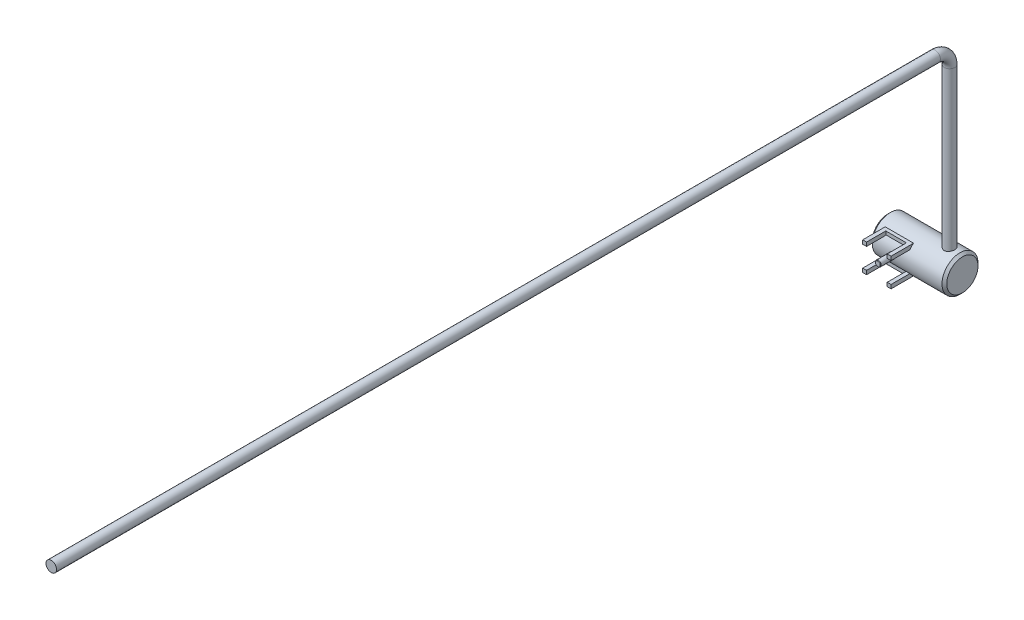
ISO-10303-21;
HEADER;
FILE_DESCRIPTION(('STEP AP214'),'2;1');
FILE_NAME('part.step','',(''),(''),'','','');
FILE_SCHEMA(('AUTOMOTIVE_DESIGN { 1 0 10303 214 1 1 1 1 }'));
ENDSEC;
DATA;
#1=APPLICATION_CONTEXT('core data for automotive mechanical design processes');
#2=APPLICATION_PROTOCOL_DEFINITION('international standard','automotive_design',2000,#1);
#3=PRODUCT_CONTEXT('',#1,'mechanical');
#4=PRODUCT('Part','Part','',(#3));
#5=PRODUCT_RELATED_PRODUCT_CATEGORY('part','',(#4));
#6=PRODUCT_DEFINITION_FORMATION('','',#4);
#7=PRODUCT_DEFINITION_CONTEXT('part definition',#1,'design');
#8=PRODUCT_DEFINITION('design','',#6,#7);
#9=PRODUCT_DEFINITION_SHAPE('','',#8);
#10=(LENGTH_UNIT() NAMED_UNIT(*) SI_UNIT(.MILLI.,.METRE.));
#11=(NAMED_UNIT(*) PLANE_ANGLE_UNIT() SI_UNIT($,.RADIAN.));
#12=(NAMED_UNIT(*) SI_UNIT($,.STERADIAN.) SOLID_ANGLE_UNIT());
#13=UNCERTAINTY_MEASURE_WITH_UNIT(LENGTH_MEASURE(1.E-05),#10,'distance_accuracy_value','');
#14=(GEOMETRIC_REPRESENTATION_CONTEXT(3) GLOBAL_UNCERTAINTY_ASSIGNED_CONTEXT((#13)) GLOBAL_UNIT_ASSIGNED_CONTEXT((#10,
#11,#12)) REPRESENTATION_CONTEXT('',''));
#15=CARTESIAN_POINT('',(0.,0.,0.));
#16=DIRECTION('',(0.,0.,1.));
#17=DIRECTION('',(1.,0.,0.));
#18=AXIS2_PLACEMENT_3D('',#15,#16,#17);
#19=CARTESIAN_POINT('',(7.65,-2.15,3.));
#20=DIRECTION('',(0.,1.,0.));
#21=DIRECTION('',(-1.,0.,0.));
#22=AXIS2_PLACEMENT_3D('',#19,#20,#21);
#23=PLANE('',#22);
#24=DIRECTION('',(1.,0.,0.));
#25=VECTOR('',#24,1.);
#26=CARTESIAN_POINT('',(7.25,-2.15,7.));
#27=LINE('',#26,#25);
#28=CARTESIAN_POINT('',(7.65,-2.15,7.));
#29=VERTEX_POINT('',#28);
#30=CARTESIAN_POINT('',(6.85,-2.15,7.));
#31=VERTEX_POINT('',#30);
#32=EDGE_CURVE('E142',#29,#31,#27,.F.);
#33=ORIENTED_EDGE('',*,*,#32,.F.);
#34=DIRECTION('',(0.,0.,-1.));
#35=VECTOR('',#34,1.);
#36=CARTESIAN_POINT('',(7.65,-2.15,0.));
#37=LINE('',#36,#35);
#38=CARTESIAN_POINT('',(7.65,-2.15,3.07245829914744));
#39=VERTEX_POINT('',#38);
#40=EDGE_CURVE('E154',#39,#29,#37,.F.);
#41=ORIENTED_EDGE('',*,*,#40,.F.);
#42=DIRECTION('',(-1.,0.,0.));
#43=VECTOR('',#42,1.);
#44=CARTESIAN_POINT('',(7.65,-2.15,3.07245829914744));
#45=LINE('',#44,#43);
#46=CARTESIAN_POINT('',(6.85,-2.15,3.07245829914744));
#47=VERTEX_POINT('',#46);
#48=EDGE_CURVE('E145',#39,#47,#45,.T.);
#49=ORIENTED_EDGE('',*,*,#48,.T.);
#50=DIRECTION('',(0.,0.,1.));
#51=VECTOR('',#50,1.);
#52=CARTESIAN_POINT('',(6.85,-2.15,3.));
#53=LINE('',#52,#51);
#54=EDGE_CURVE('E219',#31,#47,#53,.F.);
#55=ORIENTED_EDGE('',*,*,#54,.F.);
#56=EDGE_LOOP('',(#33,#41,#49,#55));
#57=FACE_BOUND('',#56,.T.);
#58=ADVANCED_FACE('F17',(#57),#23,.T.);
#59=CARTESIAN_POINT('',(2.55,-2.15,3.));
#60=DIRECTION('',(0.,1.,0.));
#61=DIRECTION('',(-1.,0.,0.));
#62=AXIS2_PLACEMENT_3D('',#59,#60,#61);
#63=PLANE('',#62);
#64=DIRECTION('',(1.,0.,0.));
#65=VECTOR('',#64,1.);
#66=CARTESIAN_POINT('',(2.15,-2.15,7.));
#67=LINE('',#66,#65);
#68=CARTESIAN_POINT('',(2.55,-2.15,7.));
#69=VERTEX_POINT('',#68);
#70=CARTESIAN_POINT('',(1.75,-2.15,7.));
#71=VERTEX_POINT('',#70);
#72=EDGE_CURVE('E199',#69,#71,#67,.F.);
#73=ORIENTED_EDGE('',*,*,#72,.F.);
#74=DIRECTION('',(0.,0.,1.));
#75=VECTOR('',#74,1.);
#76=CARTESIAN_POINT('',(2.55,-2.15,3.));
#77=LINE('',#76,#75);
#78=CARTESIAN_POINT('',(2.55,-2.15,3.07245829914744));
#79=VERTEX_POINT('',#78);
#80=EDGE_CURVE('E205',#79,#69,#77,.T.);
#81=ORIENTED_EDGE('',*,*,#80,.F.);
#82=DIRECTION('',(-1.,0.,0.));
#83=VECTOR('',#82,1.);
#84=CARTESIAN_POINT('',(2.55,-2.15,3.07245829914744));
#85=LINE('',#84,#83);
#86=CARTESIAN_POINT('',(1.75,-2.15,3.07245829914744));
#87=VERTEX_POINT('',#86);
#88=EDGE_CURVE('E152',#79,#87,#85,.T.);
#89=ORIENTED_EDGE('',*,*,#88,.T.);
#90=DIRECTION('',(0.,0.,1.));
#91=VECTOR('',#90,1.);
#92=CARTESIAN_POINT('',(1.75,-2.15,0.));
#93=LINE('',#92,#91);
#94=EDGE_CURVE('E368',#71,#87,#93,.F.);
#95=ORIENTED_EDGE('',*,*,#94,.F.);
#96=EDGE_LOOP('',(#73,#81,#89,#95));
#97=FACE_BOUND('',#96,.T.);
#98=ADVANCED_FACE('F692',(#97),#63,.T.);
#99=CARTESIAN_POINT('',(1.75,2.15,3.));
#100=DIRECTION('',(0.,-1.,0.));
#101=DIRECTION('',(0.,0.,-1.));
#102=AXIS2_PLACEMENT_3D('',#99,#100,#101);
#103=PLANE('',#102);
#104=DIRECTION('',(1.,0.,0.));
#105=VECTOR('',#104,1.);
#106=CARTESIAN_POINT('',(2.15,2.15,7.));
#107=LINE('',#106,#105);
#108=CARTESIAN_POINT('',(1.75,2.15,7.));
#109=VERTEX_POINT('',#108);
#110=CARTESIAN_POINT('',(2.55,2.15,7.));
#111=VERTEX_POINT('',#110);
#112=EDGE_CURVE('E185',#109,#111,#107,.T.);
#113=ORIENTED_EDGE('',*,*,#112,.F.);
#114=DIRECTION('',(0.,0.,1.));
#115=VECTOR('',#114,1.);
#116=CARTESIAN_POINT('',(1.75,2.15,0.));
#117=LINE('',#116,#115);
#118=CARTESIAN_POINT('',(1.75,2.15,3.07245829914744));
#119=VERTEX_POINT('',#118);
#120=EDGE_CURVE('E188',#119,#109,#117,.T.);
#121=ORIENTED_EDGE('',*,*,#120,.F.);
#122=DIRECTION('',(1.,0.,0.));
#123=VECTOR('',#122,1.);
#124=CARTESIAN_POINT('',(1.75,2.15,3.07245829914744));
#125=LINE('',#124,#123);
#126=CARTESIAN_POINT('',(2.55,2.15,3.07245829914744));
#127=VERTEX_POINT('',#126);
#128=EDGE_CURVE('E164',#119,#127,#125,.T.);
#129=ORIENTED_EDGE('',*,*,#128,.T.);
#130=DIRECTION('',(0.,0.,-1.));
#131=VECTOR('',#130,1.);
#132=CARTESIAN_POINT('',(2.55,2.15,3.));
#133=LINE('',#132,#131);
#134=EDGE_CURVE('E191',#111,#127,#133,.T.);
#135=ORIENTED_EDGE('',*,*,#134,.F.);
#136=EDGE_LOOP('',(#113,#121,#129,#135));
#137=FACE_BOUND('',#136,.T.);
#138=ADVANCED_FACE('F683',(#137),#103,.T.);
#139=CARTESIAN_POINT('',(6.85,2.15,3.));
#140=DIRECTION('',(0.,-1.,0.));
#141=DIRECTION('',(1.,0.,0.));
#142=AXIS2_PLACEMENT_3D('',#139,#140,#141);
#143=PLANE('',#142);
#144=DIRECTION('',(1.,0.,0.));
#145=VECTOR('',#144,1.);
#146=CARTESIAN_POINT('',(7.25,2.15,7.));
#147=LINE('',#146,#145);
#148=CARTESIAN_POINT('',(6.85,2.15,7.));
#149=VERTEX_POINT('',#148);
#150=CARTESIAN_POINT('',(7.65,2.15,7.));
#151=VERTEX_POINT('',#150);
#152=EDGE_CURVE('E175',#149,#151,#147,.T.);
#153=ORIENTED_EDGE('',*,*,#152,.F.);
#154=DIRECTION('',(0.,0.,1.));
#155=VECTOR('',#154,1.);
#156=CARTESIAN_POINT('',(6.85,2.15,3.));
#157=LINE('',#156,#155);
#158=CARTESIAN_POINT('',(6.85,2.15,3.07245829914744));
#159=VERTEX_POINT('',#158);
#160=EDGE_CURVE('E180',#159,#149,#157,.T.);
#161=ORIENTED_EDGE('',*,*,#160,.F.);
#162=DIRECTION('',(1.,0.,0.));
#163=VECTOR('',#162,1.);
#164=CARTESIAN_POINT('',(6.85,2.15,3.07245829914744));
#165=LINE('',#164,#163);
#166=CARTESIAN_POINT('',(7.65,2.15,3.07245829914744));
#167=VERTEX_POINT('',#166);
#168=EDGE_CURVE('E162',#159,#167,#165,.T.);
#169=ORIENTED_EDGE('',*,*,#168,.T.);
#170=DIRECTION('',(0.,0.,-1.));
#171=VECTOR('',#170,1.);
#172=CARTESIAN_POINT('',(7.65,2.15,0.));
#173=LINE('',#172,#171);
#174=EDGE_CURVE('E293',#151,#167,#173,.T.);
#175=ORIENTED_EDGE('',*,*,#174,.F.);
#176=EDGE_LOOP('',(#153,#161,#169,#175));
#177=FACE_BOUND('',#176,.T.);
#178=ADVANCED_FACE('F673',(#177),#143,.T.);
#179=CARTESIAN_POINT('',(4.7,0.,6.8));
#180=DIRECTION('',(0.,0.,1.));
#181=DIRECTION('',(1.,0.,0.));
#182=AXIS2_PLACEMENT_3D('',#179,#180,#181);
#183=PLANE('',#182);
#184=CARTESIAN_POINT('',(4.7,0.,6.79999999999836));
#185=DIRECTION('',(0.,0.,-1.));
#186=DIRECTION('',(-1.,0.,0.));
#187=AXIS2_PLACEMENT_3D('',#184,#185,#186);
#188=CIRCLE('',#187,0.500000000031105);
#189=CARTESIAN_POINT('',(4.1999999999689,0.,6.79999999999836));
#190=VERTEX_POINT('',#189);
#191=EDGE_CURVE('E295',#190,#190,#188,.T.);
#192=ORIENTED_EDGE('',*,*,#191,.F.);
#193=EDGE_LOOP('',(#192));
#194=FACE_BOUND('',#193,.T.);
#195=ADVANCED_FACE('F663',(#194),#183,.T.);
#196=CARTESIAN_POINT('',(0.,0.,0.));
#197=DIRECTION('',(1.,0.,0.));
#198=DIRECTION('',(0.,0.,-1.));
#199=AXIS2_PLACEMENT_3D('',#196,#197,#198);
#200=PLANE('',#199);
#201=CARTESIAN_POINT('',(0.,0.,0.));
#202=DIRECTION('',(1.,0.,0.));
#203=DIRECTION('',(0.,0.,-1.));
#204=AXIS2_PLACEMENT_3D('',#201,#202,#203);
#205=CIRCLE('',#204,3.24999999997999);
#206=CARTESIAN_POINT('',(0.,0.,-3.24999999997999));
#207=VERTEX_POINT('',#206);
#208=EDGE_CURVE('E408',#207,#207,#205,.T.);
#209=ORIENTED_EDGE('',*,*,#208,.F.);
#210=EDGE_LOOP('',(#209));
#211=FACE_BOUND('',#210,.T.);
#212=ADVANCED_FACE('F654',(#211),#200,.F.);
#213=CARTESIAN_POINT('',(7.65,-2.95,0.));
#214=DIRECTION('',(1.,0.,0.));
#215=DIRECTION('',(0.,0.,-1.));
#216=AXIS2_PLACEMENT_3D('',#213,#214,#215);
#217=PLANE('',#216);
#218=DIRECTION('',(0.,1.,0.));
#219=VECTOR('',#218,1.);
#220=CARTESIAN_POINT('',(7.65,-2.55,7.));
#221=LINE('',#220,#219);
#222=CARTESIAN_POINT('',(7.65,-2.95,7.));
#223=VERTEX_POINT('',#222);
#224=EDGE_CURVE('E224',#223,#29,#221,.T.);
#225=ORIENTED_EDGE('',*,*,#224,.F.);
#226=DIRECTION('',(0.,0.,-1.));
#227=VECTOR('',#226,1.);
#228=CARTESIAN_POINT('',(7.65,-2.95,0.));
#229=LINE('',#228,#227);
#230=CARTESIAN_POINT('',(7.65,-2.95,2.31516738055804));
#231=VERTEX_POINT('',#230);
#232=EDGE_CURVE('E160',#231,#223,#229,.F.);
#233=ORIENTED_EDGE('',*,*,#232,.F.);
#234=CARTESIAN_POINT('',(7.65,0.,0.));
#235=DIRECTION('',(1.,0.,0.));
#236=DIRECTION('',(0.,0.,-1.));
#237=AXIS2_PLACEMENT_3D('',#234,#235,#236);
#238=CIRCLE('',#237,3.75);
#239=EDGE_CURVE('E20',#231,#39,#238,.F.);
#240=ORIENTED_EDGE('',*,*,#239,.T.);
#241=ORIENTED_EDGE('',*,*,#40,.T.);
#242=EDGE_LOOP('',(#225,#233,#240,#241));
#243=FACE_BOUND('',#242,.T.);
#244=ADVANCED_FACE('F158',(#243),#217,.T.);
#245=CARTESIAN_POINT('',(7.25,-2.55,7.));
#246=DIRECTION('',(0.,0.,1.));
#247=DIRECTION('',(1.,0.,0.));
#248=AXIS2_PLACEMENT_3D('',#245,#246,#247);
#249=PLANE('',#248);
#250=DIRECTION('',(1.,0.,0.));
#251=VECTOR('',#250,1.);
#252=CARTESIAN_POINT('',(1.75,-2.95,7.));
#253=LINE('',#252,#251);
#254=CARTESIAN_POINT('',(6.85,-2.95,7.));
#255=VERTEX_POINT('',#254);
#256=EDGE_CURVE('E292',#223,#255,#253,.F.);
#257=ORIENTED_EDGE('',*,*,#256,.F.);
#258=ORIENTED_EDGE('',*,*,#224,.T.);
#259=ORIENTED_EDGE('',*,*,#32,.T.);
#260=DIRECTION('',(0.,-1.,0.));
#261=VECTOR('',#260,1.);
#262=CARTESIAN_POINT('',(6.85,-2.15,7.));
#263=LINE('',#262,#261);
#264=EDGE_CURVE('E217',#255,#31,#263,.F.);
#265=ORIENTED_EDGE('',*,*,#264,.F.);
#266=EDGE_LOOP('',(#257,#258,#259,#265));
#267=FACE_BOUND('',#266,.T.);
#268=ADVANCED_FACE('F637',(#267),#249,.T.);
#269=CARTESIAN_POINT('',(6.85,-2.15,3.));
#270=DIRECTION('',(-1.,0.,0.));
#271=DIRECTION('',(0.,-1.,0.));
#272=AXIS2_PLACEMENT_3D('',#269,#270,#271);
#273=PLANE('',#272);
#274=ORIENTED_EDGE('',*,*,#264,.T.);
#275=ORIENTED_EDGE('',*,*,#54,.T.);
#276=CARTESIAN_POINT('',(6.85,0.,0.));
#277=DIRECTION('',(-1.,0.,0.));
#278=DIRECTION('',(0.,-1.,0.));
#279=AXIS2_PLACEMENT_3D('',#276,#277,#278);
#280=CIRCLE('',#279,3.75);
#281=CARTESIAN_POINT('',(6.85,-2.25,3.));
#282=VERTEX_POINT('',#281);
#283=EDGE_CURVE('E150',#47,#282,#280,.F.);
#284=ORIENTED_EDGE('',*,*,#283,.T.);
#285=DIRECTION('',(0.,-1.,0.));
#286=VECTOR('',#285,1.);
#287=CARTESIAN_POINT('',(6.85,-2.15,3.));
#288=LINE('',#287,#286);
#289=CARTESIAN_POINT('',(6.85,-2.95,3.));
#290=VERTEX_POINT('',#289);
#291=EDGE_CURVE('E215',#282,#290,#288,.T.);
#292=ORIENTED_EDGE('',*,*,#291,.T.);
#293=DIRECTION('',(0.,0.,-1.));
#294=VECTOR('',#293,1.);
#295=CARTESIAN_POINT('',(6.85,-2.95,0.));
#296=LINE('',#295,#294);
#297=EDGE_CURVE('E288',#255,#290,#296,.T.);
#298=ORIENTED_EDGE('',*,*,#297,.F.);
#299=EDGE_LOOP('',(#274,#275,#284,#292,#298));
#300=FACE_BOUND('',#299,.T.);
#301=ADVANCED_FACE('F627',(#300),#273,.T.);
#302=CARTESIAN_POINT('',(2.55,-2.95,3.));
#303=DIRECTION('',(1.,0.,0.));
#304=DIRECTION('',(0.,1.,0.));
#305=AXIS2_PLACEMENT_3D('',#302,#303,#304);
#306=PLANE('',#305);
#307=DIRECTION('',(0.,0.,-1.));
#308=VECTOR('',#307,1.);
#309=CARTESIAN_POINT('',(2.55,-2.95,0.));
#310=LINE('',#309,#308);
#311=CARTESIAN_POINT('',(2.55,-2.95,3.));
#312=VERTEX_POINT('',#311);
#313=CARTESIAN_POINT('',(2.55,-2.95,7.));
#314=VERTEX_POINT('',#313);
#315=EDGE_CURVE('E291',#312,#314,#310,.F.);
#316=ORIENTED_EDGE('',*,*,#315,.F.);
#317=DIRECTION('',(0.,1.,0.));
#318=VECTOR('',#317,1.);
#319=CARTESIAN_POINT('',(2.55,-2.95,3.));
#320=LINE('',#319,#318);
#321=CARTESIAN_POINT('',(2.55,-2.25,3.));
#322=VERTEX_POINT('',#321);
#323=EDGE_CURVE('E207',#312,#322,#320,.T.);
#324=ORIENTED_EDGE('',*,*,#323,.T.);
#325=CARTESIAN_POINT('',(2.55,0.,0.));
#326=DIRECTION('',(1.,0.,0.));
#327=DIRECTION('',(0.,1.,0.));
#328=AXIS2_PLACEMENT_3D('',#325,#326,#327);
#329=CIRCLE('',#328,3.75);
#330=EDGE_CURVE('E208',#322,#79,#329,.F.);
#331=ORIENTED_EDGE('',*,*,#330,.T.);
#332=ORIENTED_EDGE('',*,*,#80,.T.);
#333=DIRECTION('',(0.,1.,0.));
#334=VECTOR('',#333,1.);
#335=CARTESIAN_POINT('',(2.55,-2.55,7.));
#336=LINE('',#335,#334);
#337=EDGE_CURVE('E202',#314,#69,#336,.T.);
#338=ORIENTED_EDGE('',*,*,#337,.F.);
#339=EDGE_LOOP('',(#316,#324,#331,#332,#338));
#340=FACE_BOUND('',#339,.T.);
#341=ADVANCED_FACE('F617',(#340),#306,.T.);
#342=CARTESIAN_POINT('',(2.15,-2.55,7.));
#343=DIRECTION('',(0.,0.,1.));
#344=DIRECTION('',(1.,0.,0.));
#345=AXIS2_PLACEMENT_3D('',#342,#343,#344);
#346=PLANE('',#345);
#347=DIRECTION('',(0.,1.,0.));
#348=VECTOR('',#347,1.);
#349=CARTESIAN_POINT('',(1.75,2.95,7.));
#350=LINE('',#349,#348);
#351=CARTESIAN_POINT('',(1.75,-2.95,7.));
#352=VERTEX_POINT('',#351);
#353=EDGE_CURVE('E371',#352,#71,#350,.T.);
#354=ORIENTED_EDGE('',*,*,#353,.F.);
#355=DIRECTION('',(1.,0.,0.));
#356=VECTOR('',#355,1.);
#357=CARTESIAN_POINT('',(1.75,-2.95,7.));
#358=LINE('',#357,#356);
#359=EDGE_CURVE('E377',#314,#352,#358,.F.);
#360=ORIENTED_EDGE('',*,*,#359,.F.);
#361=ORIENTED_EDGE('',*,*,#337,.T.);
#362=ORIENTED_EDGE('',*,*,#72,.T.);
#363=EDGE_LOOP('',(#354,#360,#361,#362));
#364=FACE_BOUND('',#363,.T.);
#365=ADVANCED_FACE('F607',(#364),#346,.T.);
#366=CARTESIAN_POINT('',(1.75,2.95,0.));
#367=DIRECTION('',(-1.,0.,0.));
#368=DIRECTION('',(0.,0.,1.));
#369=AXIS2_PLACEMENT_3D('',#366,#367,#368);
#370=PLANE('',#369);
#371=ORIENTED_EDGE('',*,*,#353,.T.);
#372=ORIENTED_EDGE('',*,*,#94,.T.);
#373=CARTESIAN_POINT('',(1.75,0.,0.));
#374=DIRECTION('',(1.,0.,0.));
#375=DIRECTION('',(0.,0.,-1.));
#376=AXIS2_PLACEMENT_3D('',#373,#374,#375);
#377=CIRCLE('',#376,3.75);
#378=CARTESIAN_POINT('',(1.75,-2.95,2.31516738055804));
#379=VERTEX_POINT('',#378);
#380=EDGE_CURVE('E201',#87,#379,#377,.T.);
#381=ORIENTED_EDGE('',*,*,#380,.T.);
#382=DIRECTION('',(0.,0.,-1.));
#383=VECTOR('',#382,1.);
#384=CARTESIAN_POINT('',(1.75,-2.95,0.));
#385=LINE('',#384,#383);
#386=EDGE_CURVE('E374',#352,#379,#385,.T.);
#387=ORIENTED_EDGE('',*,*,#386,.F.);
#388=EDGE_LOOP('',(#371,#372,#381,#387));
#389=FACE_BOUND('',#388,.T.);
#390=ADVANCED_FACE('F597',(#389),#370,.T.);
#391=CARTESIAN_POINT('',(1.75,2.95,0.));
#392=DIRECTION('',(-1.,0.,0.));
#393=DIRECTION('',(0.,0.,1.));
#394=AXIS2_PLACEMENT_3D('',#391,#392,#393);
#395=PLANE('',#394);
#396=DIRECTION('',(0.,1.,0.));
#397=VECTOR('',#396,1.);
#398=CARTESIAN_POINT('',(1.75,2.55,7.));
#399=LINE('',#398,#397);
#400=CARTESIAN_POINT('',(1.75,2.95,7.));
#401=VERTEX_POINT('',#400);
#402=EDGE_CURVE('E187',#401,#109,#399,.F.);
#403=ORIENTED_EDGE('',*,*,#402,.F.);
#404=DIRECTION('',(0.,0.,1.));
#405=VECTOR('',#404,1.);
#406=CARTESIAN_POINT('',(1.75,2.95,0.));
#407=LINE('',#406,#405);
#408=CARTESIAN_POINT('',(1.75,2.95,2.31516738055804));
#409=VERTEX_POINT('',#408);
#410=EDGE_CURVE('E336',#409,#401,#407,.T.);
#411=ORIENTED_EDGE('',*,*,#410,.F.);
#412=CARTESIAN_POINT('',(1.75,0.,0.));
#413=DIRECTION('',(1.,0.,0.));
#414=DIRECTION('',(0.,0.,-1.));
#415=AXIS2_PLACEMENT_3D('',#412,#413,#414);
#416=CIRCLE('',#415,3.75);
#417=EDGE_CURVE('E363',#409,#119,#416,.T.);
#418=ORIENTED_EDGE('',*,*,#417,.T.);
#419=ORIENTED_EDGE('',*,*,#120,.T.);
#420=EDGE_LOOP('',(#403,#411,#418,#419));
#421=FACE_BOUND('',#420,.T.);
#422=ADVANCED_FACE('F587',(#421),#395,.T.);
#423=CARTESIAN_POINT('',(2.15,2.55,7.));
#424=DIRECTION('',(0.,0.,1.));
#425=DIRECTION('',(1.,0.,0.));
#426=AXIS2_PLACEMENT_3D('',#423,#424,#425);
#427=PLANE('',#426);
#428=DIRECTION('',(1.,0.,0.));
#429=VECTOR('',#428,1.);
#430=CARTESIAN_POINT('',(7.65,2.95,7.));
#431=LINE('',#430,#429);
#432=CARTESIAN_POINT('',(2.55,2.95,7.));
#433=VERTEX_POINT('',#432);
#434=EDGE_CURVE('E341',#401,#433,#431,.T.);
#435=ORIENTED_EDGE('',*,*,#434,.F.);
#436=ORIENTED_EDGE('',*,*,#402,.T.);
#437=ORIENTED_EDGE('',*,*,#112,.T.);
#438=DIRECTION('',(0.,1.,0.));
#439=VECTOR('',#438,1.);
#440=CARTESIAN_POINT('',(2.55,2.15,7.));
#441=LINE('',#440,#439);
#442=EDGE_CURVE('E194',#433,#111,#441,.F.);
#443=ORIENTED_EDGE('',*,*,#442,.F.);
#444=EDGE_LOOP('',(#435,#436,#437,#443));
#445=FACE_BOUND('',#444,.T.);
#446=ADVANCED_FACE('F577',(#445),#427,.T.);
#447=CARTESIAN_POINT('',(2.55,2.15,3.));
#448=DIRECTION('',(1.,0.,0.));
#449=DIRECTION('',(0.,0.,-1.));
#450=AXIS2_PLACEMENT_3D('',#447,#448,#449);
#451=PLANE('',#450);
#452=ORIENTED_EDGE('',*,*,#442,.T.);
#453=ORIENTED_EDGE('',*,*,#134,.T.);
#454=CARTESIAN_POINT('',(2.55,0.,0.));
#455=DIRECTION('',(1.,0.,0.));
#456=DIRECTION('',(0.,0.,-1.));
#457=AXIS2_PLACEMENT_3D('',#454,#455,#456);
#458=CIRCLE('',#457,3.75);
#459=CARTESIAN_POINT('',(2.55,2.25,3.));
#460=VERTEX_POINT('',#459);
#461=EDGE_CURVE('E346',#127,#460,#458,.F.);
#462=ORIENTED_EDGE('',*,*,#461,.T.);
#463=DIRECTION('',(0.,1.,0.));
#464=VECTOR('',#463,1.);
#465=CARTESIAN_POINT('',(2.55,0.,3.));
#466=LINE('',#465,#464);
#467=CARTESIAN_POINT('',(2.55,2.95,3.));
#468=VERTEX_POINT('',#467);
#469=EDGE_CURVE('E330',#468,#460,#466,.F.);
#470=ORIENTED_EDGE('',*,*,#469,.F.);
#471=DIRECTION('',(0.,0.,1.));
#472=VECTOR('',#471,1.);
#473=CARTESIAN_POINT('',(2.55,2.95,0.));
#474=LINE('',#473,#472);
#475=EDGE_CURVE('E324',#433,#468,#474,.F.);
#476=ORIENTED_EDGE('',*,*,#475,.F.);
#477=EDGE_LOOP('',(#452,#453,#462,#470,#476));
#478=FACE_BOUND('',#477,.T.);
#479=ADVANCED_FACE('F567',(#478),#451,.T.);
#480=CARTESIAN_POINT('',(6.85,2.95,3.));
#481=DIRECTION('',(-1.,0.,0.));
#482=DIRECTION('',(0.,-1.,0.));
#483=AXIS2_PLACEMENT_3D('',#480,#481,#482);
#484=PLANE('',#483);
#485=DIRECTION('',(0.,0.,1.));
#486=VECTOR('',#485,1.);
#487=CARTESIAN_POINT('',(6.85,2.95,0.));
#488=LINE('',#487,#486);
#489=CARTESIAN_POINT('',(6.85,2.95,3.));
#490=VERTEX_POINT('',#489);
#491=CARTESIAN_POINT('',(6.85,2.95,7.));
#492=VERTEX_POINT('',#491);
#493=EDGE_CURVE('E310',#490,#492,#488,.T.);
#494=ORIENTED_EDGE('',*,*,#493,.F.);
#495=DIRECTION('',(0.,1.,0.));
#496=VECTOR('',#495,1.);
#497=CARTESIAN_POINT('',(6.85,0.,3.));
#498=LINE('',#497,#496);
#499=CARTESIAN_POINT('',(6.85,2.25,3.));
#500=VERTEX_POINT('',#499);
#501=EDGE_CURVE('E327',#500,#490,#498,.T.);
#502=ORIENTED_EDGE('',*,*,#501,.F.);
#503=CARTESIAN_POINT('',(6.85,0.,0.));
#504=DIRECTION('',(-1.,0.,0.));
#505=DIRECTION('',(0.,-1.,0.));
#506=AXIS2_PLACEMENT_3D('',#503,#504,#505);
#507=CIRCLE('',#506,3.75);
#508=EDGE_CURVE('E182',#500,#159,#507,.F.);
#509=ORIENTED_EDGE('',*,*,#508,.T.);
#510=ORIENTED_EDGE('',*,*,#160,.T.);
#511=DIRECTION('',(0.,1.,0.));
#512=VECTOR('',#511,1.);
#513=CARTESIAN_POINT('',(6.85,2.55,7.));
#514=LINE('',#513,#512);
#515=EDGE_CURVE('E177',#492,#149,#514,.F.);
#516=ORIENTED_EDGE('',*,*,#515,.F.);
#517=EDGE_LOOP('',(#494,#502,#509,#510,#516));
#518=FACE_BOUND('',#517,.T.);
#519=ADVANCED_FACE('F558',(#518),#484,.T.);
#520=CARTESIAN_POINT('',(7.25,2.55,7.));
#521=DIRECTION('',(0.,0.,1.));
#522=DIRECTION('',(1.,0.,0.));
#523=AXIS2_PLACEMENT_3D('',#520,#521,#522);
#524=PLANE('',#523);
#525=DIRECTION('',(0.,1.,0.));
#526=VECTOR('',#525,1.);
#527=CARTESIAN_POINT('',(7.65,-2.95,7.));
#528=LINE('',#527,#526);
#529=CARTESIAN_POINT('',(7.65,2.95,7.));
#530=VERTEX_POINT('',#529);
#531=EDGE_CURVE('E97',#530,#151,#528,.F.);
#532=ORIENTED_EDGE('',*,*,#531,.F.);
#533=DIRECTION('',(1.,0.,0.));
#534=VECTOR('',#533,1.);
#535=CARTESIAN_POINT('',(7.65,2.95,7.));
#536=LINE('',#535,#534);
#537=EDGE_CURVE('E299',#492,#530,#536,.T.);
#538=ORIENTED_EDGE('',*,*,#537,.F.);
#539=ORIENTED_EDGE('',*,*,#515,.T.);
#540=ORIENTED_EDGE('',*,*,#152,.T.);
#541=EDGE_LOOP('',(#532,#538,#539,#540));
#542=FACE_BOUND('',#541,.T.);
#543=ADVANCED_FACE('F549',(#542),#524,.T.);
#544=CARTESIAN_POINT('',(7.65,-2.95,0.));
#545=DIRECTION('',(1.,0.,0.));
#546=DIRECTION('',(0.,0.,-1.));
#547=AXIS2_PLACEMENT_3D('',#544,#545,#546);
#548=PLANE('',#547);
#549=ORIENTED_EDGE('',*,*,#531,.T.);
#550=ORIENTED_EDGE('',*,*,#174,.T.);
#551=CARTESIAN_POINT('',(7.65,0.,0.));
#552=DIRECTION('',(1.,0.,0.));
#553=DIRECTION('',(0.,0.,-1.));
#554=AXIS2_PLACEMENT_3D('',#551,#552,#553);
#555=CIRCLE('',#554,3.75);
#556=CARTESIAN_POINT('',(7.65,2.95,2.31516738055804));
#557=VERTEX_POINT('',#556);
#558=EDGE_CURVE('E35',#167,#557,#555,.F.);
#559=ORIENTED_EDGE('',*,*,#558,.T.);
#560=DIRECTION('',(0.,0.,1.));
#561=VECTOR('',#560,1.);
#562=CARTESIAN_POINT('',(7.65,2.95,0.));
#563=LINE('',#562,#561);
#564=EDGE_CURVE('E285',#530,#557,#563,.F.);
#565=ORIENTED_EDGE('',*,*,#564,.F.);
#566=EDGE_LOOP('',(#549,#550,#559,#565));
#567=FACE_BOUND('',#566,.T.);
#568=ADVANCED_FACE('F449',(#567),#548,.T.);
#569=CARTESIAN_POINT('',(4.7,0.,6.69999999996662));
#570=DIRECTION('',(0.,0.,-1.));
#571=DIRECTION('',(-1.,0.,0.));
#572=AXIS2_PLACEMENT_3D('',#569,#570,#571);
#573=CONICAL_SURFACE('',#572,0.600000000006003,0.785398163113231);
#574=CARTESIAN_POINT('',(4.7,0.,6.7));
#575=DIRECTION('',(0.,0.,1.));
#576=DIRECTION('',(1.,0.,0.));
#577=AXIS2_PLACEMENT_3D('',#574,#575,#576);
#578=CIRCLE('',#577,0.6);
#579=CARTESIAN_POINT('',(5.3,0.,6.7));
#580=VERTEX_POINT('',#579);
#581=EDGE_CURVE('E282',#580,#580,#578,.F.);
#582=ORIENTED_EDGE('',*,*,#581,.F.);
#583=EDGE_LOOP('',(#582));
#584=FACE_BOUND('',#583,.T.);
#585=ORIENTED_EDGE('',*,*,#191,.T.);
#586=EDGE_LOOP('',(#585));
#587=FACE_BOUND('',#586,.T.);
#588=ADVANCED_FACE('F439',(#584,#587),#573,.T.);
#589=CARTESIAN_POINT('',(15.5,0.,0.));
#590=DIRECTION('',(1.,0.,0.));
#591=DIRECTION('',(0.,0.,-1.));
#592=AXIS2_PLACEMENT_3D('',#589,#590,#591);
#593=PLANE('',#592);
#594=CARTESIAN_POINT('',(15.5000000000314,0.,0.));
#595=DIRECTION('',(-1.,0.,0.));
#596=DIRECTION('',(0.,0.,1.));
#597=AXIS2_PLACEMENT_3D('',#594,#595,#596);
#598=CIRCLE('',#597,3.24999999997999);
#599=CARTESIAN_POINT('',(15.5000000000314,0.,3.24999999997999));
#600=VERTEX_POINT('',#599);
#601=EDGE_CURVE('E279',#600,#600,#598,.T.);
#602=ORIENTED_EDGE('',*,*,#601,.F.);
#603=EDGE_LOOP('',(#602));
#604=FACE_BOUND('',#603,.T.);
#605=ADVANCED_FACE('F436',(#604),#593,.T.);
#606=CARTESIAN_POINT('',(0.499999999931333,0.,0.));
#607=DIRECTION('',(1.,0.,0.));
#608=DIRECTION('',(0.,0.,-1.));
#609=AXIS2_PLACEMENT_3D('',#606,#607,#608);
#610=CONICAL_SURFACE('',#609,3.74999999991132,0.785398163397448);
#611=CARTESIAN_POINT('',(0.5,0.,0.));
#612=DIRECTION('',(1.,0.,0.));
#613=DIRECTION('',(0.,0.,-1.));
#614=AXIS2_PLACEMENT_3D('',#611,#612,#613);
#615=CIRCLE('',#614,3.75);
#616=CARTESIAN_POINT('',(0.5,0.,-3.75));
#617=VERTEX_POINT('',#616);
#618=EDGE_CURVE('E276',#617,#617,#615,.T.);
#619=ORIENTED_EDGE('',*,*,#618,.F.);
#620=EDGE_LOOP('',(#619));
#621=FACE_BOUND('',#620,.T.);
#622=ORIENTED_EDGE('',*,*,#208,.T.);
#623=EDGE_LOOP('',(#622));
#624=FACE_BOUND('',#623,.T.);
#625=ADVANCED_FACE('F438',(#621,#624),#610,.T.);
#626=CARTESIAN_POINT('',(1.75,-2.95,0.));
#627=DIRECTION('',(0.,-1.,0.));
#628=DIRECTION('',(0.,0.,-1.));
#629=AXIS2_PLACEMENT_3D('',#626,#627,#628);
#630=PLANE('',#629);
#631=ORIENTED_EDGE('',*,*,#359,.T.);
#632=ORIENTED_EDGE('',*,*,#386,.T.);
#633=DIRECTION('',(1.,0.,0.));
#634=VECTOR('',#633,1.);
#635=CARTESIAN_POINT('',(0.,-2.95,2.31516738055804));
#636=LINE('',#635,#634);
#637=EDGE_CURVE('E214',#231,#379,#636,.F.);
#638=ORIENTED_EDGE('',*,*,#637,.F.);
#639=ORIENTED_EDGE('',*,*,#232,.T.);
#640=ORIENTED_EDGE('',*,*,#256,.T.);
#641=ORIENTED_EDGE('',*,*,#297,.T.);
#642=DIRECTION('',(1.,0.,0.));
#643=VECTOR('',#642,1.);
#644=CARTESIAN_POINT('',(4.7,-2.95,3.));
#645=LINE('',#644,#643);
#646=EDGE_CURVE('E331',#312,#290,#645,.T.);
#647=ORIENTED_EDGE('',*,*,#646,.F.);
#648=ORIENTED_EDGE('',*,*,#315,.T.);
#649=EDGE_LOOP('',(#631,#632,#638,#639,#640,#641,#647,#648));
#650=FACE_BOUND('',#649,.T.);
#651=ADVANCED_FACE('F446',(#650),#630,.T.);
#652=CARTESIAN_POINT('',(4.7,0.,3.));
#653=DIRECTION('',(0.,0.,1.));
#654=DIRECTION('',(1.,0.,0.));
#655=AXIS2_PLACEMENT_3D('',#652,#653,#654);
#656=PLANE('',#655);
#657=ORIENTED_EDGE('',*,*,#323,.F.);
#658=ORIENTED_EDGE('',*,*,#646,.T.);
#659=ORIENTED_EDGE('',*,*,#291,.F.);
#660=DIRECTION('',(1.,0.,0.));
#661=VECTOR('',#660,1.);
#662=CARTESIAN_POINT('',(0.,-2.25,3.));
#663=LINE('',#662,#661);
#664=EDGE_CURVE('E211',#322,#282,#663,.T.);
#665=ORIENTED_EDGE('',*,*,#664,.F.);
#666=EDGE_LOOP('',(#657,#658,#659,#665));
#667=FACE_BOUND('',#666,.T.);
#668=ADVANCED_FACE('F507',(#667),#656,.T.);
#669=CARTESIAN_POINT('',(4.7,0.,3.));
#670=DIRECTION('',(0.,0.,1.));
#671=DIRECTION('',(1.,0.,0.));
#672=AXIS2_PLACEMENT_3D('',#669,#670,#671);
#673=PLANE('',#672);
#674=ORIENTED_EDGE('',*,*,#469,.T.);
#675=DIRECTION('',(1.,0.,0.));
#676=VECTOR('',#675,1.);
#677=CARTESIAN_POINT('',(0.,2.25,3.));
#678=LINE('',#677,#676);
#679=EDGE_CURVE('E213',#500,#460,#678,.F.);
#680=ORIENTED_EDGE('',*,*,#679,.F.);
#681=ORIENTED_EDGE('',*,*,#501,.T.);
#682=DIRECTION('',(1.,0.,0.));
#683=VECTOR('',#682,1.);
#684=CARTESIAN_POINT('',(7.65,2.95,3.));
#685=LINE('',#684,#683);
#686=EDGE_CURVE('E319',#468,#490,#685,.T.);
#687=ORIENTED_EDGE('',*,*,#686,.F.);
#688=EDGE_LOOP('',(#674,#680,#681,#687));
#689=FACE_BOUND('',#688,.T.);
#690=ADVANCED_FACE('F499',(#689),#673,.T.);
#691=CARTESIAN_POINT('',(7.65,2.95,0.));
#692=DIRECTION('',(0.,1.,0.));
#693=DIRECTION('',(0.,0.,1.));
#694=AXIS2_PLACEMENT_3D('',#691,#692,#693);
#695=PLANE('',#694);
#696=ORIENTED_EDGE('',*,*,#537,.T.);
#697=ORIENTED_EDGE('',*,*,#564,.T.);
#698=DIRECTION('',(1.,0.,0.));
#699=VECTOR('',#698,1.);
#700=CARTESIAN_POINT('',(0.,2.95,2.31516738055804));
#701=LINE('',#700,#699);
#702=EDGE_CURVE('E302',#409,#557,#701,.T.);
#703=ORIENTED_EDGE('',*,*,#702,.F.);
#704=ORIENTED_EDGE('',*,*,#410,.T.);
#705=ORIENTED_EDGE('',*,*,#434,.T.);
#706=ORIENTED_EDGE('',*,*,#475,.T.);
#707=ORIENTED_EDGE('',*,*,#686,.T.);
#708=ORIENTED_EDGE('',*,*,#493,.T.);
#709=EDGE_LOOP('',(#696,#697,#703,#704,#705,#706,#707,#708));
#710=FACE_BOUND('',#709,.T.);
#711=ADVANCED_FACE('F492',(#710),#695,.T.);
#712=CARTESIAN_POINT('',(4.7,0.,3.));
#713=DIRECTION('',(0.,0.,1.));
#714=DIRECTION('',(1.,0.,0.));
#715=AXIS2_PLACEMENT_3D('',#712,#713,#714);
#716=CYLINDRICAL_SURFACE('',#715,0.6);
#717=ORIENTED_EDGE('',*,*,#581,.T.);
#718=EDGE_LOOP('',(#717));
#719=FACE_BOUND('',#718,.T.);
#720=CARTESIAN_POINT('',(4.7,-0.6,3.70168880377592));
#721=CARTESIAN_POINT('',(4.6665299853926,-0.599998638805061,3.7016893910516));
#722=CARTESIAN_POINT('',(4.63304121774738,-0.597189916563029,3.70214766550149));
#723=CARTESIAN_POINT('',(4.56700194580611,-0.586033336504624,3.70392975391263));
#724=CARTESIAN_POINT('',(4.5344523576505,-0.577680249060207,3.70525438503278));
#725=CARTESIAN_POINT('',(4.47125680606627,-0.555692918810645,3.70861540500467));
#726=CARTESIAN_POINT('',(4.44060932850552,-0.542062940777472,3.71065121895049));
#727=CARTESIAN_POINT('',(4.38204005588437,-0.509919124945488,3.71520453872793));
#728=CARTESIAN_POINT('',(4.35411792651947,-0.491405887185181,3.71772198536772));
#729=CARTESIAN_POINT('',(4.30153432016117,-0.449841420709385,3.72298050257008));
#730=CARTESIAN_POINT('',(4.27690122034699,-0.42675449612274,3.72572322590661));
#731=CARTESIAN_POINT('',(4.23184116210203,-0.376775129445709,3.73110855048436));
#732=CARTESIAN_POINT('',(4.21141444540979,-0.34988246879151,3.73375114596417));
#733=CARTESIAN_POINT('',(4.17524121161247,-0.292871975108791,3.73865587824148));
#734=CARTESIAN_POINT('',(4.15952099289856,-0.262737253342152,3.74091584763851));
#735=CARTESIAN_POINT('',(4.13337591828201,-0.200212798767288,3.74478233286796));
#736=CARTESIAN_POINT('',(4.1229507447528,-0.16782320135174,3.74638888789469));
#737=CARTESIAN_POINT('',(4.10777817669127,-0.10200123868382,3.74875586450117));
#738=CARTESIAN_POINT('',(4.10298316417847,-0.068580109007822,3.74952337852798));
#739=CARTESIAN_POINT('',(4.09905904757429,-0.0013994422566755,3.7501501385298));
#740=CARTESIAN_POINT('',(4.09992958725652,0.0323600734089033,3.75000944160936));
#741=CARTESIAN_POINT('',(4.10727454570551,0.0989339147935595,3.74884126844106));
#742=CARTESIAN_POINT('',(4.1136977252742,0.131754056196424,3.74782190072555));
#743=CARTESIAN_POINT('',(4.13188505438739,0.195844602824302,3.74501995792721));
#744=CARTESIAN_POINT('',(4.14364935644282,0.227114963768454,3.74323736105113));
#745=CARTESIAN_POINT('',(4.17223653761003,0.287371795922712,3.73909539010352));
#746=CARTESIAN_POINT('',(4.18908071821874,0.316347988048151,3.7367335952239));
#747=CARTESIAN_POINT('',(4.2273339285851,0.371081901471099,3.73169596844834));
#748=CARTESIAN_POINT('',(4.24874329945123,0.39683938204004,3.72902011309269));
#749=CARTESIAN_POINT('',(4.29580386906807,0.444707164720607,3.72361697106476));
#750=CARTESIAN_POINT('',(4.32149983275227,0.466773452464799,3.72088944389063));
#751=CARTESIAN_POINT('',(4.37625282688158,0.506288042482323,3.71571941552183));
#752=CARTESIAN_POINT('',(4.40530988380682,0.523736308369339,3.71327691657304));
#753=CARTESIAN_POINT('',(4.4660091529871,0.553527094881877,3.70895344649553));
#754=CARTESIAN_POINT('',(4.49765385054691,0.565864636265755,3.70707302347645));
#755=CARTESIAN_POINT('',(4.562603186493,0.585037062035834,3.70409593175684));
#756=CARTESIAN_POINT('',(4.5959076906093,0.591872390758532,3.70299919976939));
#757=CARTESIAN_POINT('',(4.66283834680204,0.599785049992887,3.7017258147518));
#758=CARTESIAN_POINT('',(4.69645691440531,0.600924979124761,3.7015391595432));
#759=CARTESIAN_POINT('',(4.76340468987969,0.597581002644736,3.70208045619169));
#760=CARTESIAN_POINT('',(4.79673390797375,0.593097296541139,3.70280837560264));
#761=CARTESIAN_POINT('',(4.86196007163332,0.578686583114582,3.70508758409938));
#762=CARTESIAN_POINT('',(4.89386417695423,0.568791160032722,3.70663409400289));
#763=CARTESIAN_POINT('',(4.95556111610501,0.543870920734068,3.71037224921463));
#764=CARTESIAN_POINT('',(4.98535383250456,0.528845819487014,3.71256393037082));
#765=CARTESIAN_POINT('',(5.04226171792444,0.493943895652236,3.71736885540902));
#766=CARTESIAN_POINT('',(5.06935188607102,0.474026790281566,3.71998553498659));
#767=CARTESIAN_POINT('',(5.11982781819102,0.429961812743084,3.72533545245458));
#768=CARTESIAN_POINT('',(5.14321334259201,0.405813667174249,3.72806869786861));
#769=CARTESIAN_POINT('',(5.18584318762786,0.353695426464365,3.73337526246222));
#770=CARTESIAN_POINT('',(5.20504586873323,0.325691064687898,3.73594680699933));
#771=CARTESIAN_POINT('',(5.23847391379655,0.266817554216568,3.74061212990155));
#772=CARTESIAN_POINT('',(5.25269942879684,0.235948492492898,3.74270592276434));
#773=CARTESIAN_POINT('',(5.27570381720561,0.172348133128302,3.74617208999229));
#774=CARTESIAN_POINT('',(5.2845048818708,0.139625028929574,3.74754740007812));
#775=CARTESIAN_POINT('',(5.29648215091775,0.0731415765659481,3.74943401725062));
#776=CARTESIAN_POINT('',(5.29965878034621,0.0393813069773198,3.74994538962616));
#777=CARTESIAN_POINT('',(5.30028553942378,-0.0278154482237147,3.75004570154289));
#778=CARTESIAN_POINT('',(5.29779916982087,-0.0612513434348961,3.74964486991635));
#779=CARTESIAN_POINT('',(5.28730734851845,-0.127222899341164,3.74798658674072));
#780=CARTESIAN_POINT('',(5.27930192199485,-0.159758564142065,3.7467291390992));
#781=CARTESIAN_POINT('',(5.25802285255163,-0.222984636933896,3.74349833683387));
#782=CARTESIAN_POINT('',(5.24475419838549,-0.253676760697447,3.74152566029199));
#783=CARTESIAN_POINT('',(5.21333226188641,-0.312408959491604,3.73708028987651));
#784=CARTESIAN_POINT('',(5.19517877766167,-0.340448924842796,3.73460757533723));
#785=CARTESIAN_POINT('',(5.15427550388435,-0.393401667440661,3.72940363918304));
#786=CARTESIAN_POINT('',(5.1314790491028,-0.41827815995714,3.72666995600456));
#787=CARTESIAN_POINT('',(5.08203503934215,-0.463875357247656,3.7212697035788));
#788=CARTESIAN_POINT('',(5.05538658328832,-0.48459508694044,3.71860315020664));
#789=CARTESIAN_POINT('',(4.99879124782029,-0.521412575210368,3.71362051515761));
#790=CARTESIAN_POINT('',(4.96882416490689,-0.537479598330242,3.71130680981952));
#791=CARTESIAN_POINT('',(4.90659251308468,-0.56432754717735,3.7073198164384));
#792=CARTESIAN_POINT('',(4.87433031453331,-0.575113838528148,3.70564587872402));
#793=CARTESIAN_POINT('',(4.81827861256616,-0.588707956987153,3.70350561014168));
#794=CARTESIAN_POINT('',(4.79483141195947,-0.592935810340823,3.70282802285249));
#795=CARTESIAN_POINT('',(4.7475926316309,-0.598582293511596,3.70191941440706));
#796=CARTESIAN_POINT('',(4.72380105738727,-0.600000967967275,3.70168838615489));
#797=CARTESIAN_POINT('',(4.7,-0.6,3.70168880377592));
#798=B_SPLINE_CURVE_WITH_KNOTS('',3,(#720,#721,#722,#723,#724,#725,#726,#727,#728,#729,#730,
#731,#732,#733,#734,#735,#736,#737,#738,#739,#740,#741,#742,#743,#744,#745,#746,#747,#748,#749,
#750,#751,#752,#753,#754,#755,#756,#757,#758,#759,#760,#761,#762,#763,#764,#765,#766,#767,#768,
#769,#770,#771,#772,#773,#774,#775,#776,#777,#778,#779,#780,#781,#782,#783,#784,#785,#786,#787,
#788,#789,#790,#791,#792,#793,#794,#795,#796,#797),.UNSPECIFIED.,.T.,.F.,(4,2,2,2,2,2,2,2,2,2,2,
2,2,2,2,2,2,2,2,2,2,2,2,2,2,2,2,2,2,2,2,2,2,2,2,2,2,2,4),(0.,0.100323024733677,
0.200740812180237,0.301077611031735,0.401402086574233,0.502542807997817,0.603689340302451,
0.705390928500286,0.807086415344516,0.907915455328981,1.00873815566346,1.10864028703697,
1.20854527120487,1.3088751545246,1.40921253706624,1.51067215300376,1.61213256833805,
1.71369160265136,1.81524243464375,1.91567461899107,2.01610324043164,2.11595189312338,
2.21580609480271,2.31651185377985,2.41722412255537,2.51889727620108,2.62056734409795,
2.72181867319238,2.8230623502511,2.92317635113351,3.02328989533581,3.12330877274033,
3.22333178459621,3.32441466318205,3.42552122583934,3.52728120272753,3.6289375680647,
3.70027999323335,3.77162128474335),.UNSPECIFIED.);
#799=CARTESIAN_POINT('',(4.7,-0.6,3.70168880377592));
#800=VERTEX_POINT('',#799);
#801=EDGE_CURVE('E242',#800,#800,#798,.T.);
#802=ORIENTED_EDGE('',*,*,#801,.F.);
#803=EDGE_LOOP('',(#802));
#804=FACE_BOUND('',#803,.T.);
#805=ADVANCED_FACE('F486',(#719,#804),#716,.T.);
#806=CARTESIAN_POINT('',(15.0000000001,0.,0.));
#807=DIRECTION('',(-1.,0.,0.));
#808=DIRECTION('',(0.,0.,1.));
#809=AXIS2_PLACEMENT_3D('',#806,#807,#808);
#810=CONICAL_SURFACE('',#809,3.74999999991132,0.785398163397448);
#811=ORIENTED_EDGE('',*,*,#601,.T.);
#812=EDGE_LOOP('',(#811));
#813=FACE_BOUND('',#812,.T.);
#814=CARTESIAN_POINT('',(15.,0.,0.));
#815=DIRECTION('',(1.,0.,0.));
#816=DIRECTION('',(0.,0.,-1.));
#817=AXIS2_PLACEMENT_3D('',#814,#815,#816);
#818=CIRCLE('',#817,3.75);
#819=CARTESIAN_POINT('',(15.,0.,-3.75));
#820=VERTEX_POINT('',#819);
#821=EDGE_CURVE('E241',#820,#820,#818,.F.);
#822=ORIENTED_EDGE('',*,*,#821,.F.);
#823=EDGE_LOOP('',(#822));
#824=FACE_BOUND('',#823,.T.);
#825=ADVANCED_FACE('F433',(#813,#824),#810,.T.);
#826=CARTESIAN_POINT('',(0.,0.,0.));
#827=DIRECTION('',(1.,0.,0.));
#828=DIRECTION('',(0.,0.,-1.));
#829=AXIS2_PLACEMENT_3D('',#826,#827,#828);
#830=CYLINDRICAL_SURFACE('',#829,3.75);
#831=ORIENTED_EDGE('',*,*,#821,.T.);
#832=EDGE_LOOP('',(#831));
#833=FACE_BOUND('',#832,.T.);
#834=ORIENTED_EDGE('',*,*,#801,.T.);
#835=EDGE_LOOP('',(#834));
#836=FACE_BOUND('',#835,.T.);
#837=ORIENTED_EDGE('',*,*,#558,.F.);
#838=ORIENTED_EDGE('',*,*,#168,.F.);
#839=ORIENTED_EDGE('',*,*,#508,.F.);
#840=ORIENTED_EDGE('',*,*,#679,.T.);
#841=ORIENTED_EDGE('',*,*,#461,.F.);
#842=ORIENTED_EDGE('',*,*,#128,.F.);
#843=ORIENTED_EDGE('',*,*,#417,.F.);
#844=ORIENTED_EDGE('',*,*,#702,.T.);
#845=EDGE_LOOP('',(#837,#838,#839,#840,#841,#842,#843,#844));
#846=FACE_BOUND('',#845,.T.);
#847=ORIENTED_EDGE('',*,*,#283,.F.);
#848=ORIENTED_EDGE('',*,*,#48,.F.);
#849=ORIENTED_EDGE('',*,*,#239,.F.);
#850=ORIENTED_EDGE('',*,*,#637,.T.);
#851=ORIENTED_EDGE('',*,*,#380,.F.);
#852=ORIENTED_EDGE('',*,*,#88,.F.);
#853=ORIENTED_EDGE('',*,*,#330,.F.);
#854=ORIENTED_EDGE('',*,*,#664,.T.);
#855=EDGE_LOOP('',(#847,#848,#849,#850,#851,#852,#853,#854));
#856=FACE_BOUND('',#855,.T.);
#857=ORIENTED_EDGE('',*,*,#618,.T.);
#858=EDGE_LOOP('',(#857));
#859=FACE_BOUND('',#858,.T.);
#860=CARTESIAN_POINT('',(12.83,3.58503835404867,1.1));
#861=CARTESIAN_POINT('',(12.890343344098,3.58503908938654,1.09999908471408));
#862=CARTESIAN_POINT('',(12.9506958097233,3.58657857287447,1.09501766835337));
#863=CARTESIAN_POINT('',(13.0696407553122,3.59254689168105,1.07527207309066));
#864=CARTESIAN_POINT('',(13.1282325790961,3.59697679060368,1.0605042930088));
#865=CARTESIAN_POINT('',(13.241917442895,3.60818199035868,1.02172695091172));
#866=CARTESIAN_POINT('',(13.2970159464663,3.61495351616323,0.997732257031327));
#867=CARTESIAN_POINT('',(13.4024179872933,3.63007394423413,0.941230635295215));
#868=CARTESIAN_POINT('',(13.4527208747679,3.6384230598,0.908722556149519));
#869=CARTESIAN_POINT('',(13.548625658937,3.65604119206573,0.835064165650746));
#870=CARTESIAN_POINT('',(13.5940610066537,3.66532914441349,0.793701484580981));
#871=CARTESIAN_POINT('',(13.6774599046041,3.68361633414402,0.703963482199238));
#872=CARTESIAN_POINT('',(13.7154225354812,3.69261553588841,0.655587299296916));
#873=CARTESIAN_POINT('',(13.7835155771328,3.70952556316094,0.552016949596949));
#874=CARTESIAN_POINT('',(13.8134770559237,3.71741146997627,0.496707293214821));
#875=CARTESIAN_POINT('',(13.863609717538,3.73098695209963,0.381564275960109));
#876=CARTESIAN_POINT('',(13.8837829144881,3.73667697920263,0.321731848665403));
#877=CARTESIAN_POINT('',(13.9132177440256,3.74508562801076,0.200983344607532));
#878=CARTESIAN_POINT('',(13.9227634629269,3.7478814634528,0.140141992979643));
#879=CARTESIAN_POINT('',(13.9315697139635,3.75045822555598,0.017661395627611));
#880=CARTESIAN_POINT('',(13.9308323145683,3.75023975855012,-0.0439776871391687));
#881=CARTESIAN_POINT('',(13.9192859097237,3.74686752887786,-0.164314320862409));
#882=CARTESIAN_POINT('',(13.9087843897804,3.74380338390635,-0.22304427979572));
#883=CARTESIAN_POINT('',(13.8785089647402,3.73519233856407,-0.337868355040784));
#884=CARTESIAN_POINT('',(13.8587344827881,3.72964528373668,-0.393962307132178));
#885=CARTESIAN_POINT('',(13.8102606397923,3.71656592614222,-0.502664183387731));
#886=CARTESIAN_POINT('',(13.7814627939017,3.70901186355827,-0.555225463780783));
#887=CARTESIAN_POINT('',(13.7158370704058,3.69272244623341,-0.654869247150942));
#888=CARTESIAN_POINT('',(13.6790073554168,3.68398682137031,-0.701950492720295));
#889=CARTESIAN_POINT('',(13.5967605586445,3.6658910053949,-0.79113317407171));
#890=CARTESIAN_POINT('',(13.5510766306804,3.65651966271749,-0.832986575605409));
#891=CARTESIAN_POINT('',(13.4532456465598,3.63849249533713,-0.908506351441827));
#892=CARTESIAN_POINT('',(13.4010980060656,3.62983673544297,-0.942171984731251));
#893=CARTESIAN_POINT('',(13.2911912107127,3.61416912444047,-1.0006041850327));
#894=CARTESIAN_POINT('',(13.2333866537234,3.60717243265986,-1.02528971362606));
#895=CARTESIAN_POINT('',(13.1141887854723,3.59579639924723,-1.06450453872283));
#896=CARTESIAN_POINT('',(13.0527965910963,3.59141624776197,-1.07903697797569));
#897=CARTESIAN_POINT('',(12.9305183972073,3.58594591602482,-1.09707709111579));
#898=CARTESIAN_POINT('',(12.8696927706501,3.58474371253309,-1.10096034335447));
#899=CARTESIAN_POINT('',(12.7482582494807,3.58545629453054,-1.09863777529398));
#900=CARTESIAN_POINT('',(12.6876493271786,3.58737066640538,-1.0924332937822));
#901=CARTESIAN_POINT('',(12.5699097325352,3.59399110240808,-1.0704452065108));
#902=CARTESIAN_POINT('',(12.5127302209503,3.59862760606579,-1.05490006459763));
#903=CARTESIAN_POINT('',(12.4017937316928,3.61009867118608,-1.0149466599752));
#904=CARTESIAN_POINT('',(12.3480372678098,3.61693356169289,-0.99053707040635));
#905=CARTESIAN_POINT('',(12.2439361529726,3.63225114115322,-0.932824973315593));
#906=CARTESIAN_POINT('',(12.1937156787143,3.64077187102328,-0.899308820889939));
#907=CARTESIAN_POINT('',(12.099474365446,3.65841777261304,-0.824590986327035));
#908=CARTESIAN_POINT('',(12.0554549482847,3.6675430822547,-0.783387546579063));
#909=CARTESIAN_POINT('',(11.9732401328896,3.68576593715141,-0.692704870172509));
#910=CARTESIAN_POINT('',(11.9353101348871,3.6948507563866,-0.642981881394277));
#911=CARTESIAN_POINT('',(11.8683279738343,3.71163825476219,-0.537662234635939));
#912=CARTESIAN_POINT('',(11.8392753571213,3.71934100452249,-0.48206587699938));
#913=CARTESIAN_POINT('',(11.7911521534958,3.73244834394167,-0.366954593570967));
#914=CARTESIAN_POINT('',(11.7720063439798,3.73787019182552,-0.307473178884385));
#915=CARTESIAN_POINT('',(11.7440409974583,3.74588107369593,-0.18595057324563));
#916=CARTESIAN_POINT('',(11.735218647491,3.74847087935176,-0.123910084368508));
#917=CARTESIAN_POINT('',(11.7283568844802,3.75048107054457,-0.00148838550278944));
#918=CARTESIAN_POINT('',(11.7299317370469,3.75001483923079,0.058869618226967));
#919=CARTESIAN_POINT('',(11.7429030841642,3.74623032214026,0.178424462470798));
#920=CARTESIAN_POINT('',(11.7542990633658,3.74291218601303,0.237621363745315));
#921=CARTESIAN_POINT('',(11.7863543507991,3.73382706868705,0.352607721296039));
#922=CARTESIAN_POINT('',(11.806921116367,3.72808458174465,0.408425043088716));
#923=CARTESIAN_POINT('',(11.8566516572452,3.71474563743064,0.51584674065261));
#924=CARTESIAN_POINT('',(11.8858168085665,3.70714888335174,0.567450440423214));
#925=CARTESIAN_POINT('',(11.9529641001224,3.69061011081175,0.666715010406375));
#926=CARTESIAN_POINT('',(11.9911911859649,3.68163373372065,0.714204421609436));
#927=CARTESIAN_POINT('',(12.0749312985611,3.66346296652736,0.802223772003526));
#928=CARTESIAN_POINT('',(12.1204463828156,3.65426851548624,0.842751739167541));
#929=CARTESIAN_POINT('',(12.2190073578319,3.63639954963517,0.916839253311264));
#930=CARTESIAN_POINT('',(12.2722290174204,3.62774692431771,0.950170814682902));
#931=CARTESIAN_POINT('',(12.3837664102492,3.61228243911195,1.00737224303884));
#932=CARTESIAN_POINT('',(12.4420794833995,3.60546962551059,1.03124701519711));
#933=CARTESIAN_POINT('',(12.5549571443029,3.59518797611217,1.06649835265207));
#934=CARTESIAN_POINT('',(12.6091362540611,3.59141670639623,1.07902798014547));
#935=CARTESIAN_POINT('',(12.7188744972604,3.58634177812039,1.09577848001926));
#936=CARTESIAN_POINT('',(12.77443338134,3.58503767691949,1.10000084283271));
#937=CARTESIAN_POINT('',(12.83,3.58503835404867,1.1));
#938=B_SPLINE_CURVE_WITH_KNOTS('',3,(#860,#861,#862,#863,#864,#865,#866,#867,#868,#869,#870,
#871,#872,#873,#874,#875,#876,#877,#878,#879,#880,#881,#882,#883,#884,#885,#886,#887,#888,#889,
#890,#891,#892,#893,#894,#895,#896,#897,#898,#899,#900,#901,#902,#903,#904,#905,#906,#907,#908,
#909,#910,#911,#912,#913,#914,#915,#916,#917,#918,#919,#920,#921,#922,#923,#924,#925,#926,#927,
#928,#929,#930,#931,#932,#933,#934,#935,#936,#937),.UNSPECIFIED.,.T.,.F.,(4,2,2,2,2,2,2,2,2,2,2,
2,2,2,2,2,2,2,2,2,2,2,2,2,2,2,2,2,2,2,2,2,2,2,2,2,2,2,4),(0.,0.18082519644953,0.36171696981542,
0.542318469669456,0.722944405415432,0.908518921026164,1.09411625332819,1.28336794946725,
1.47258068691237,1.65660408092823,1.84059045880759,2.01897224391544,2.19736512732179,
2.37777719015946,2.55823056773198,2.745346366492,2.93247909339868,3.12126094557341,
3.30998433699632,3.49196055807071,3.67391263025363,3.8514059365956,4.0289258216754,
4.21103631758266,4.39318850212145,4.58187154037443,4.77054493470271,4.95776389145793,
5.14493182244189,5.32519590548301,5.50545053000852,5.68392597593856,5.86242999904603,
6.04645864967894,6.23053934599349,6.41979612822986,6.60895461527219,6.77549573243361,
6.94200696719224),.UNSPECIFIED.);
#939=CARTESIAN_POINT('',(12.83,3.58503835404867,1.1));
#940=VERTEX_POINT('',#939);
#941=EDGE_CURVE('E234',#940,#940,#938,.T.);
#942=ORIENTED_EDGE('',*,*,#941,.F.);
#943=EDGE_LOOP('',(#942));
#944=FACE_BOUND('',#943,.T.);
#945=ADVANCED_FACE('F146',(#833,#836,#846,#856,#859,#944),#830,.T.);
#946=CARTESIAN_POINT('',(12.83,0.,0.));
#947=DIRECTION('',(0.,1.,0.));
#948=DIRECTION('',(0.,0.,1.));
#949=AXIS2_PLACEMENT_3D('',#946,#947,#948);
#950=CYLINDRICAL_SURFACE('',#949,1.1);
#951=ORIENTED_EDGE('',*,*,#941,.T.);
#952=EDGE_LOOP('',(#951));
#953=FACE_BOUND('',#952,.T.);
#954=CARTESIAN_POINT('',(12.83,36.6,0.));
#955=DIRECTION('',(0.,1.,0.));
#956=DIRECTION('',(0.,0.,-1.));
#957=AXIS2_PLACEMENT_3D('',#954,#955,#956);
#958=CIRCLE('',#957,1.1);
#959=CARTESIAN_POINT('',(12.83,36.6,-1.1));
#960=VERTEX_POINT('',#959);
#961=EDGE_CURVE('E233',#960,#960,#958,.T.);
#962=ORIENTED_EDGE('',*,*,#961,.F.);
#963=EDGE_LOOP('',(#962));
#964=FACE_BOUND('',#963,.T.);
#965=ADVANCED_FACE('F249',(#953,#964),#950,.T.);
#966=CARTESIAN_POINT('',(12.83,39.6,187.));
#967=DIRECTION('',(0.,0.,1.));
#968=DIRECTION('',(0.,-1.,0.));
#969=AXIS2_PLACEMENT_3D('',#966,#967,#968);
#970=PLANE('',#969);
#971=CARTESIAN_POINT('',(12.83,39.6,187.));
#972=DIRECTION('',(0.,0.,1.));
#973=DIRECTION('',(0.,-1.,0.));
#974=AXIS2_PLACEMENT_3D('',#971,#972,#973);
#975=CIRCLE('',#974,1.1);
#976=CARTESIAN_POINT('',(12.83,38.5,187.));
#977=VERTEX_POINT('',#976);
#978=EDGE_CURVE('E26',#977,#977,#975,.F.);
#979=ORIENTED_EDGE('',*,*,#978,.F.);
#980=EDGE_LOOP('',(#979));
#981=FACE_BOUND('',#980,.T.);
#982=ADVANCED_FACE('F253',(#981),#970,.T.);
#983=CARTESIAN_POINT('',(12.83,36.6,3.));
#984=DIRECTION('',(1.,0.,0.));
#985=DIRECTION('',(0.,0.,-1.));
#986=AXIS2_PLACEMENT_3D('',#983,#984,#985);
#987=TOROIDAL_SURFACE('',#986,3.,1.1);
#988=ORIENTED_EDGE('',*,*,#961,.T.);
#989=EDGE_LOOP('',(#988));
#990=FACE_BOUND('',#989,.T.);
#991=CARTESIAN_POINT('',(12.83,39.6,3.));
#992=DIRECTION('',(0.,0.,1.));
#993=DIRECTION('',(0.,-1.,0.));
#994=AXIS2_PLACEMENT_3D('',#991,#992,#993);
#995=CIRCLE('',#994,1.1);
#996=CARTESIAN_POINT('',(12.83,38.5,3.));
#997=VERTEX_POINT('',#996);
#998=EDGE_CURVE('E11',#997,#997,#995,.T.);
#999=ORIENTED_EDGE('',*,*,#998,.F.);
#1000=EDGE_LOOP('',(#999));
#1001=FACE_BOUND('',#1000,.T.);
#1002=ADVANCED_FACE('F257',(#990,#1001),#987,.T.);
#1003=CARTESIAN_POINT('',(12.83,39.6,3.));
#1004=DIRECTION('',(0.,0.,1.));
#1005=DIRECTION('',(0.,-1.,0.));
#1006=AXIS2_PLACEMENT_3D('',#1003,#1004,#1005);
#1007=CYLINDRICAL_SURFACE('',#1006,1.1);
#1008=ORIENTED_EDGE('',*,*,#998,.T.);
#1009=EDGE_LOOP('',(#1008));
#1010=FACE_BOUND('',#1009,.T.);
#1011=ORIENTED_EDGE('',*,*,#978,.T.);
#1012=EDGE_LOOP('',(#1011));
#1013=FACE_BOUND('',#1012,.T.);
#1014=ADVANCED_FACE('F262',(#1010,#1013),#1007,.T.);
#1015=CLOSED_SHELL('',(#58,#98,#138,#178,#195,#212,#244,#268,#301,#341,#365,#390,#422,#446,#479,
#519,#543,#568,#588,#605,#625,#651,#668,#690,#711,#805,#825,#945,#965,#982,#1002,#1014));
#1016=MANIFOLD_SOLID_BREP('B1',#1015);
#1017=ADVANCED_BREP_SHAPE_REPRESENTATION('',(#18,#1016),#14);
#1018=SHAPE_DEFINITION_REPRESENTATION(#9,#1017);
ENDSEC;
END-ISO-10303-21;
